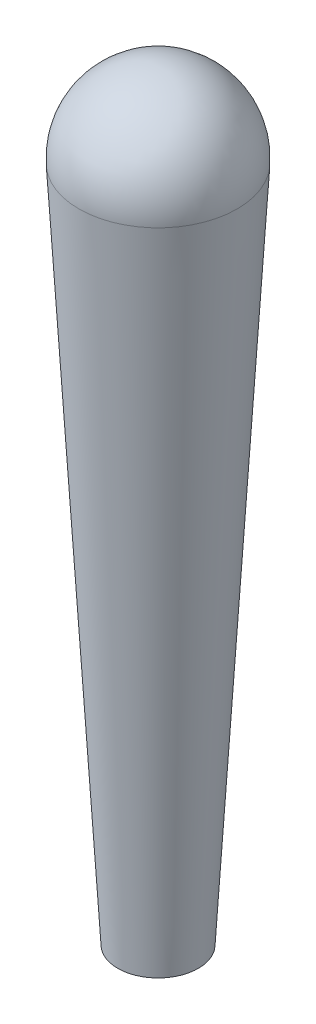
ISO-10303-21;
HEADER;
FILE_DESCRIPTION(('STEP AP214'),'2;1');
FILE_NAME('part.step','',(''),(''),'','','');
FILE_SCHEMA(('AUTOMOTIVE_DESIGN { 1 0 10303 214 1 1 1 1 }'));
ENDSEC;
DATA;
#1=APPLICATION_CONTEXT('core data for automotive mechanical design processes');
#2=APPLICATION_PROTOCOL_DEFINITION('international standard','automotive_design',2000,#1);
#3=PRODUCT_CONTEXT('',#1,'mechanical');
#4=PRODUCT('Part','Part','',(#3));
#5=PRODUCT_RELATED_PRODUCT_CATEGORY('part','',(#4));
#6=PRODUCT_DEFINITION_FORMATION('','',#4);
#7=PRODUCT_DEFINITION_CONTEXT('part definition',#1,'design');
#8=PRODUCT_DEFINITION('design','',#6,#7);
#9=PRODUCT_DEFINITION_SHAPE('','',#8);
#10=(LENGTH_UNIT() NAMED_UNIT(*) SI_UNIT(.MILLI.,.METRE.));
#11=(NAMED_UNIT(*) PLANE_ANGLE_UNIT() SI_UNIT($,.RADIAN.));
#12=(NAMED_UNIT(*) SI_UNIT($,.STERADIAN.) SOLID_ANGLE_UNIT());
#13=UNCERTAINTY_MEASURE_WITH_UNIT(LENGTH_MEASURE(1.E-05),#10,'distance_accuracy_value','');
#14=(GEOMETRIC_REPRESENTATION_CONTEXT(3) GLOBAL_UNCERTAINTY_ASSIGNED_CONTEXT((#13)) GLOBAL_UNIT_ASSIGNED_CONTEXT((#10,
#11,#12)) REPRESENTATION_CONTEXT('',''));
#15=CARTESIAN_POINT('',(0.,0.,0.));
#16=DIRECTION('',(0.,0.,1.));
#17=DIRECTION('',(1.,0.,0.));
#18=AXIS2_PLACEMENT_3D('',#15,#16,#17);
#19=CARTESIAN_POINT('',(-1.542288,-1.27,1.542288));
#20=DIRECTION('',(0.,-1.,0.));
#21=DIRECTION('',(0.,0.,-1.));
#22=AXIS2_PLACEMENT_3D('',#19,#20,#21);
#23=PLANE('',#22);
#24=CARTESIAN_POINT('',(0.,-1.27,0.));
#25=DIRECTION('',(0.,1.,0.));
#26=DIRECTION('',(0.,0.,1.));
#27=AXIS2_PLACEMENT_3D('',#24,#25,#26);
#28=CIRCLE('',#27,1.524);
#29=CARTESIAN_POINT('',(0.,-1.27,1.524));
#30=VERTEX_POINT('',#29);
#31=EDGE_CURVE('E20',#30,#30,#28,.T.);
#32=ORIENTED_EDGE('',*,*,#31,.F.);
#33=EDGE_LOOP('',(#32));
#34=FACE_BOUND('',#33,.T.);
#35=ADVANCED_FACE('F17',(#34),#23,.T.);
#36=CARTESIAN_POINT('',(0.,-1.27,0.));
#37=DIRECTION('',(0.,1.,0.));
#38=DIRECTION('',(0.,0.,1.));
#39=AXIS2_PLACEMENT_3D('',#36,#37,#38);
#40=CONICAL_SURFACE('',#39,1.524,0.0572710785948784);
#41=CARTESIAN_POINT('',(0.,24.3394409440797,0.));
#42=DIRECTION('',(0.,-1.,0.));
#43=DIRECTION('',(0.,0.,-1.));
#44=AXIS2_PLACEMENT_3D('',#41,#42,#43);
#45=CIRCLE('',#44,2.99228597068055);
#46=CARTESIAN_POINT('',(0.,24.3394409440797,-2.99228597068056));
#47=VERTEX_POINT('',#46);
#48=EDGE_CURVE('E11',#47,#47,#45,.F.);
#49=ORIENTED_EDGE('',*,*,#48,.F.);
#50=EDGE_LOOP('',(#49));
#51=FACE_BOUND('',#50,.T.);
#52=ORIENTED_EDGE('',*,*,#31,.T.);
#53=EDGE_LOOP('',(#52));
#54=FACE_BOUND('',#53,.T.);
#55=ADVANCED_FACE('F29',(#51,#54),#40,.T.);
#56=CARTESIAN_POINT('',(0.,24.511,0.));
#57=DIRECTION('',(0.,-1.,0.));
#58=DIRECTION('',(0.,0.,-1.));
#59=AXIS2_PLACEMENT_3D('',#56,#57,#58);
#60=SPHERICAL_SURFACE('',#59,2.99719999999999);
#61=ORIENTED_EDGE('',*,*,#48,.T.);
#62=EDGE_LOOP('',(#61));
#63=FACE_BOUND('',#62,.T.);
#64=CARTESIAN_POINT('',(0.,27.5082,0.));
#65=VERTEX_POINT('',#64);
#66=VERTEX_LOOP('',#65);
#67=FACE_BOUND('',#66,.T.);
#68=ADVANCED_FACE('F27',(#63,#67),#60,.T.);
#69=CLOSED_SHELL('',(#35,#55,#68));
#70=MANIFOLD_SOLID_BREP('B1',#69);
#71=ADVANCED_BREP_SHAPE_REPRESENTATION('',(#18,#70),#14);
#72=SHAPE_DEFINITION_REPRESENTATION(#9,#71);
ENDSEC;
END-ISO-10303-21;
